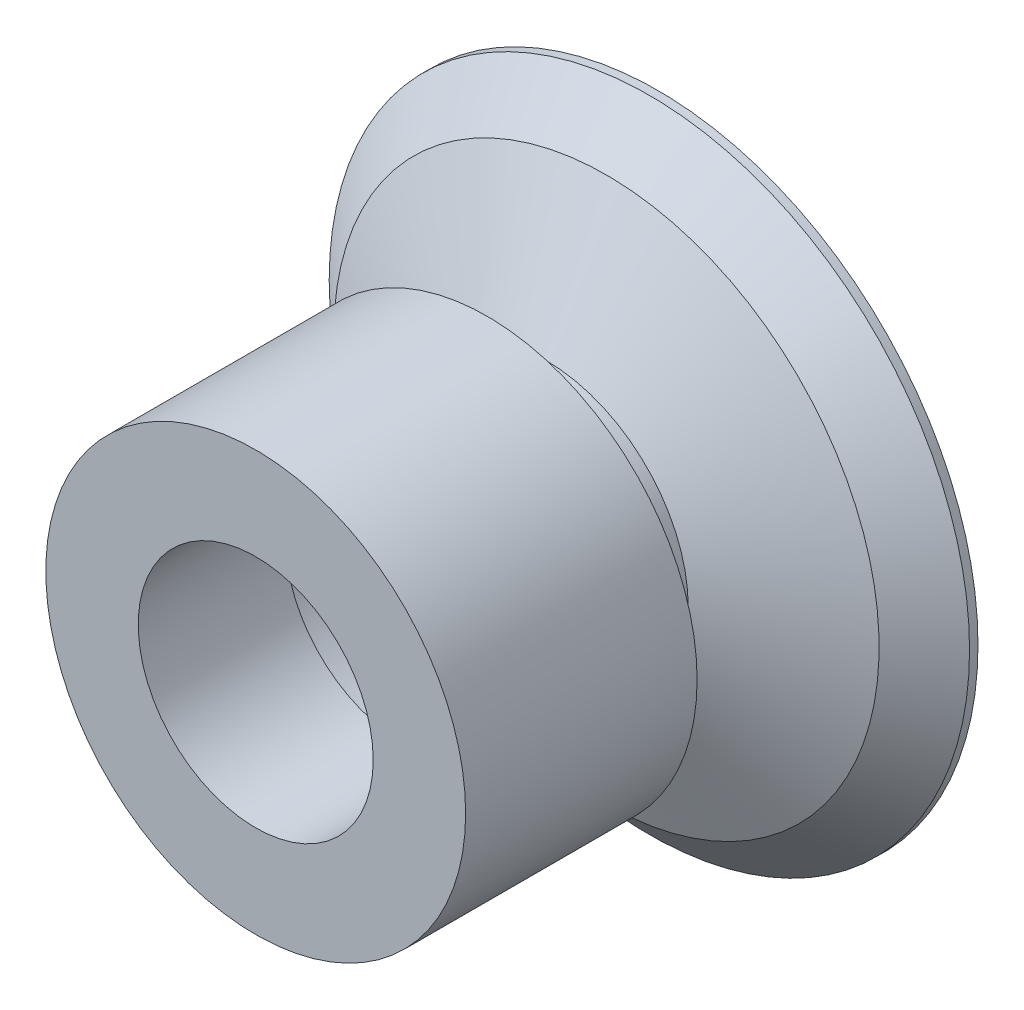
ISO-10303-21;
HEADER;
FILE_DESCRIPTION(('STEP AP214'),'2;1');
FILE_NAME('part.step','',(''),(''),'','','');
FILE_SCHEMA(('AUTOMOTIVE_DESIGN { 1 0 10303 214 1 1 1 1 }'));
ENDSEC;
DATA;
#1=APPLICATION_CONTEXT('core data for automotive mechanical design processes');
#2=APPLICATION_PROTOCOL_DEFINITION('international standard','automotive_design',2000,#1);
#3=PRODUCT_CONTEXT('',#1,'mechanical');
#4=PRODUCT('Part','Part','',(#3));
#5=PRODUCT_RELATED_PRODUCT_CATEGORY('part','',(#4));
#6=PRODUCT_DEFINITION_FORMATION('','',#4);
#7=PRODUCT_DEFINITION_CONTEXT('part definition',#1,'design');
#8=PRODUCT_DEFINITION('design','',#6,#7);
#9=PRODUCT_DEFINITION_SHAPE('','',#8);
#10=(LENGTH_UNIT() NAMED_UNIT(*) SI_UNIT(.MILLI.,.METRE.));
#11=(NAMED_UNIT(*) PLANE_ANGLE_UNIT() SI_UNIT($,.RADIAN.));
#12=(NAMED_UNIT(*) SI_UNIT($,.STERADIAN.) SOLID_ANGLE_UNIT());
#13=UNCERTAINTY_MEASURE_WITH_UNIT(LENGTH_MEASURE(1.E-05),#10,'distance_accuracy_value','');
#14=(GEOMETRIC_REPRESENTATION_CONTEXT(3) GLOBAL_UNCERTAINTY_ASSIGNED_CONTEXT((#13)) GLOBAL_UNIT_ASSIGNED_CONTEXT((#10,
#11,#12)) REPRESENTATION_CONTEXT('',''));
#15=CARTESIAN_POINT('',(0.,0.,0.));
#16=DIRECTION('',(0.,0.,1.));
#17=DIRECTION('',(1.,0.,0.));
#18=AXIS2_PLACEMENT_3D('',#15,#16,#17);
#19=CARTESIAN_POINT('',(2.,0.,-6.8));
#20=DIRECTION('',(0.,0.,1.));
#21=DIRECTION('',(1.,0.,0.));
#22=AXIS2_PLACEMENT_3D('',#19,#20,#21);
#23=PLANE('',#22);
#24=CARTESIAN_POINT('',(0.,0.,-6.8));
#25=DIRECTION('',(0.,0.,1.));
#26=DIRECTION('',(1.,0.,0.));
#27=AXIS2_PLACEMENT_3D('',#24,#25,#26);
#28=CIRCLE('',#27,2.);
#29=CARTESIAN_POINT('',(2.,0.,-6.8));
#30=VERTEX_POINT('',#29);
#31=EDGE_CURVE('E105',#30,#30,#28,.T.);
#32=ORIENTED_EDGE('',*,*,#31,.F.);
#33=EDGE_LOOP('',(#32));
#34=FACE_BOUND('',#33,.T.);
#35=CARTESIAN_POINT('',(0.,0.,-6.8));
#36=DIRECTION('',(0.,0.,1.));
#37=DIRECTION('',(1.,0.,0.));
#38=AXIS2_PLACEMENT_3D('',#35,#36,#37);
#39=CIRCLE('',#38,5.2);
#40=CARTESIAN_POINT('',(5.2,0.,-6.8));
#41=VERTEX_POINT('',#40);
#42=EDGE_CURVE('E113',#41,#41,#39,.T.);
#43=ORIENTED_EDGE('',*,*,#42,.T.);
#44=EDGE_LOOP('',(#43));
#45=FACE_BOUND('',#44,.T.);
#46=ADVANCED_FACE('F16',(#34,#45),#23,.T.);
#47=CARTESIAN_POINT('',(7.9404907888358,0.,-11.5));
#48=DIRECTION('',(0.,0.,-1.));
#49=DIRECTION('',(0.,-1.,0.));
#50=AXIS2_PLACEMENT_3D('',#47,#48,#49);
#51=PLANE('',#50);
#52=CARTESIAN_POINT('',(0.,0.,-11.5));
#53=DIRECTION('',(0.,0.,1.));
#54=DIRECTION('',(1.,0.,0.));
#55=AXIS2_PLACEMENT_3D('',#52,#53,#54);
#56=CIRCLE('',#55,2.);
#57=CARTESIAN_POINT('',(2.,0.,-11.5));
#58=VERTEX_POINT('',#57);
#59=EDGE_CURVE('E118',#58,#58,#56,.T.);
#60=ORIENTED_EDGE('',*,*,#59,.T.);
#61=EDGE_LOOP('',(#60));
#62=FACE_BOUND('',#61,.T.);
#63=CARTESIAN_POINT('',(0.,0.,-11.5));
#64=DIRECTION('',(0.,0.,1.));
#65=DIRECTION('',(1.,0.,0.));
#66=AXIS2_PLACEMENT_3D('',#63,#64,#65);
#67=CIRCLE('',#66,7.9404907888358);
#68=CARTESIAN_POINT('',(7.9404907888358,0.,-11.5));
#69=VERTEX_POINT('',#68);
#70=EDGE_CURVE('E97',#69,#69,#67,.T.);
#71=ORIENTED_EDGE('',*,*,#70,.F.);
#72=EDGE_LOOP('',(#71));
#73=FACE_BOUND('',#72,.T.);
#74=ADVANCED_FACE('F150',(#62,#73),#51,.T.);
#75=CARTESIAN_POINT('',(10.2192427366873,0.,-12.8333333333333));
#76=DIRECTION('',(0.,0.,-1.));
#77=DIRECTION('',(0.,-1.,0.));
#78=AXIS2_PLACEMENT_3D('',#75,#76,#77);
#79=PLANE('',#78);
#80=CARTESIAN_POINT('',(0.,0.,-12.8333333333333));
#81=DIRECTION('',(0.,0.,1.));
#82=DIRECTION('',(1.,0.,0.));
#83=AXIS2_PLACEMENT_3D('',#80,#81,#82);
#84=CIRCLE('',#83,10.);
#85=CARTESIAN_POINT('',(-10.,0.,-12.8333333333333));
#86=VERTEX_POINT('',#85);
#87=EDGE_CURVE('E92',#86,#86,#84,.T.);
#88=ORIENTED_EDGE('',*,*,#87,.T.);
#89=EDGE_LOOP('',(#88));
#90=FACE_BOUND('',#89,.T.);
#91=CARTESIAN_POINT('',(0.,0.,-12.8333333333333));
#92=DIRECTION('',(0.,0.,1.));
#93=DIRECTION('',(1.,0.,0.));
#94=AXIS2_PLACEMENT_3D('',#91,#92,#93);
#95=CIRCLE('',#94,10.2192427366873);
#96=CARTESIAN_POINT('',(-10.2192427366873,0.,-12.8333333333333));
#97=VERTEX_POINT('',#96);
#98=EDGE_CURVE('E96',#97,#97,#95,.T.);
#99=ORIENTED_EDGE('',*,*,#98,.F.);
#100=EDGE_LOOP('',(#99));
#101=FACE_BOUND('',#100,.T.);
#102=ADVANCED_FACE('F18',(#90,#101),#79,.T.);
#103=CARTESIAN_POINT('',(3.75,0.,0.));
#104=DIRECTION('',(0.,0.,1.));
#105=DIRECTION('',(1.,0.,0.));
#106=AXIS2_PLACEMENT_3D('',#103,#104,#105);
#107=PLANE('',#106);
#108=CARTESIAN_POINT('',(0.,0.,0.));
#109=DIRECTION('',(0.,0.,1.));
#110=DIRECTION('',(1.,0.,0.));
#111=AXIS2_PLACEMENT_3D('',#108,#109,#110);
#112=CIRCLE('',#111,3.75);
#113=CARTESIAN_POINT('',(3.75,0.,0.));
#114=VERTEX_POINT('',#113);
#115=EDGE_CURVE('E11',#114,#114,#112,.T.);
#116=ORIENTED_EDGE('',*,*,#115,.F.);
#117=EDGE_LOOP('',(#116));
#118=FACE_BOUND('',#117,.T.);
#119=CARTESIAN_POINT('',(0.,0.,0.));
#120=DIRECTION('',(0.,0.,1.));
#121=DIRECTION('',(1.,0.,0.));
#122=AXIS2_PLACEMENT_3D('',#119,#120,#121);
#123=CIRCLE('',#122,6.7);
#124=CARTESIAN_POINT('',(6.7,0.,0.));
#125=VERTEX_POINT('',#124);
#126=EDGE_CURVE('E175',#125,#125,#123,.T.);
#127=ORIENTED_EDGE('',*,*,#126,.T.);
#128=EDGE_LOOP('',(#127));
#129=FACE_BOUND('',#128,.T.);
#130=ADVANCED_FACE('F136',(#118,#129),#107,.T.);
#131=CARTESIAN_POINT('',(5.2,0.,-4.7));
#132=DIRECTION('',(0.,0.,-1.));
#133=DIRECTION('',(0.,-1.,0.));
#134=AXIS2_PLACEMENT_3D('',#131,#132,#133);
#135=PLANE('',#134);
#136=CARTESIAN_POINT('',(0.,0.,-4.7));
#137=DIRECTION('',(0.,0.,1.));
#138=DIRECTION('',(1.,0.,0.));
#139=AXIS2_PLACEMENT_3D('',#136,#137,#138);
#140=CIRCLE('',#139,3.75);
#141=CARTESIAN_POINT('',(3.75,0.,-4.7));
#142=VERTEX_POINT('',#141);
#143=EDGE_CURVE('E27',#142,#142,#140,.T.);
#144=ORIENTED_EDGE('',*,*,#143,.T.);
#145=EDGE_LOOP('',(#144));
#146=FACE_BOUND('',#145,.T.);
#147=CARTESIAN_POINT('',(0.,0.,-4.7));
#148=DIRECTION('',(0.,0.,1.));
#149=DIRECTION('',(1.,0.,0.));
#150=AXIS2_PLACEMENT_3D('',#147,#148,#149);
#151=CIRCLE('',#150,5.2);
#152=CARTESIAN_POINT('',(5.2,0.,-4.7));
#153=VERTEX_POINT('',#152);
#154=EDGE_CURVE('E20',#153,#153,#151,.T.);
#155=ORIENTED_EDGE('',*,*,#154,.F.);
#156=EDGE_LOOP('',(#155));
#157=FACE_BOUND('',#156,.T.);
#158=ADVANCED_FACE('F133',(#146,#157),#135,.T.);
#159=CARTESIAN_POINT('',(0.,0.,0.));
#160=DIRECTION('',(0.,0.,1.));
#161=DIRECTION('',(1.,0.,0.));
#162=AXIS2_PLACEMENT_3D('',#159,#160,#161);
#163=CYLINDRICAL_SURFACE('',#162,3.75);
#164=ORIENTED_EDGE('',*,*,#115,.T.);
#165=EDGE_LOOP('',(#164));
#166=FACE_BOUND('',#165,.T.);
#167=ORIENTED_EDGE('',*,*,#143,.F.);
#168=EDGE_LOOP('',(#167));
#169=FACE_BOUND('',#168,.T.);
#170=ADVANCED_FACE('F135',(#166,#169),#163,.F.);
#171=CARTESIAN_POINT('',(0.,0.,0.));
#172=DIRECTION('',(0.,0.,1.));
#173=DIRECTION('',(1.,0.,0.));
#174=AXIS2_PLACEMENT_3D('',#171,#172,#173);
#175=CYLINDRICAL_SURFACE('',#174,6.7);
#176=ORIENTED_EDGE('',*,*,#126,.F.);
#177=EDGE_LOOP('',(#176));
#178=FACE_BOUND('',#177,.T.);
#179=CARTESIAN_POINT('',(0.,0.,-7.38736139801687));
#180=DIRECTION('',(0.,0.,1.));
#181=DIRECTION('',(1.,0.,0.));
#182=AXIS2_PLACEMENT_3D('',#179,#180,#181);
#183=CIRCLE('',#182,6.7);
#184=CARTESIAN_POINT('',(6.7,0.,-7.38736139801687));
#185=VERTEX_POINT('',#184);
#186=EDGE_CURVE('E111',#185,#185,#183,.T.);
#187=ORIENTED_EDGE('',*,*,#186,.T.);
#188=EDGE_LOOP('',(#187));
#189=FACE_BOUND('',#188,.T.);
#190=ADVANCED_FACE('F144',(#178,#189),#175,.T.);
#191=CARTESIAN_POINT('',(0.,0.,-7.38736139801687));
#192=DIRECTION('',(0.,0.,1.));
#193=DIRECTION('',(1.,0.,0.));
#194=AXIS2_PLACEMENT_3D('',#191,#192,#193);
#195=CONICAL_SURFACE('',#194,6.7,0.994837673636784);
#196=ORIENTED_EDGE('',*,*,#186,.F.);
#197=EDGE_LOOP('',(#196));
#198=FACE_BOUND('',#197,.T.);
#199=CARTESIAN_POINT('',(0.,0.,-8.78653957608782));
#200=DIRECTION('',(0.,0.,1.));
#201=DIRECTION('',(1.,0.,0.));
#202=AXIS2_PLACEMENT_3D('',#199,#200,#201);
#203=CIRCLE('',#202,4.54545454545455);
#204=CARTESIAN_POINT('',(4.54545454545455,0.,-8.78653957608782));
#205=VERTEX_POINT('',#204);
#206=EDGE_CURVE('E109',#205,#205,#203,.T.);
#207=ORIENTED_EDGE('',*,*,#206,.T.);
#208=EDGE_LOOP('',(#207));
#209=FACE_BOUND('',#208,.T.);
#210=ADVANCED_FACE('F164',(#198,#209),#195,.T.);
#211=CARTESIAN_POINT('',(0.,0.,0.));
#212=DIRECTION('',(0.,0.,1.));
#213=DIRECTION('',(1.,0.,0.));
#214=AXIS2_PLACEMENT_3D('',#211,#212,#213);
#215=CYLINDRICAL_SURFACE('',#214,4.54545454545455);
#216=ORIENTED_EDGE('',*,*,#206,.F.);
#217=EDGE_LOOP('',(#216));
#218=FACE_BOUND('',#217,.T.);
#219=CARTESIAN_POINT('',(0.,0.,-9.25854996026619));
#220=DIRECTION('',(0.,0.,1.));
#221=DIRECTION('',(1.,0.,0.));
#222=AXIS2_PLACEMENT_3D('',#219,#220,#221);
#223=CIRCLE('',#222,4.54545454545455);
#224=CARTESIAN_POINT('',(-4.54545454545455,0.,-9.25854996026619));
#225=VERTEX_POINT('',#224);
#226=EDGE_CURVE('E112',#225,#225,#223,.T.);
#227=ORIENTED_EDGE('',*,*,#226,.T.);
#228=EDGE_LOOP('',(#227));
#229=FACE_BOUND('',#228,.T.);
#230=ADVANCED_FACE('F169',(#218,#229),#215,.T.);
#231=CARTESIAN_POINT('',(0.,0.,-9.25854996026619));
#232=DIRECTION('',(0.,0.,-1.));
#233=DIRECTION('',(-1.,0.,0.));
#234=AXIS2_PLACEMENT_3D('',#231,#232,#233);
#235=CONICAL_SURFACE('',#234,4.54545454545455,1.13446401379632);
#236=CARTESIAN_POINT('',(0.,0.,-11.1959273395966));
#237=DIRECTION('',(0.,0.,1.));
#238=DIRECTION('',(1.,0.,0.));
#239=AXIS2_PLACEMENT_3D('',#236,#237,#238);
#240=CIRCLE('',#239,8.70017374306742);
#241=CARTESIAN_POINT('',(-8.70017374306742,0.,-11.1959273395966));
#242=VERTEX_POINT('',#241);
#243=EDGE_CURVE('E184',#242,#242,#240,.T.);
#244=ORIENTED_EDGE('',*,*,#243,.T.);
#245=EDGE_LOOP('',(#244));
#246=FACE_BOUND('',#245,.T.);
#247=ORIENTED_EDGE('',*,*,#226,.F.);
#248=EDGE_LOOP('',(#247));
#249=FACE_BOUND('',#248,.T.);
#250=ADVANCED_FACE('F273',(#246,#249),#235,.T.);
#251=CARTESIAN_POINT('',(0.,0.,-11.1959273395966));
#252=DIRECTION('',(0.,0.,-1.));
#253=DIRECTION('',(-1.,0.,0.));
#254=AXIS2_PLACEMENT_3D('',#251,#252,#253);
#255=CONICAL_SURFACE('',#254,8.70017374306742,0.83775804095727);
#256=CARTESIAN_POINT('',(0.,0.,-12.5637032050195));
#257=DIRECTION('',(0.,0.,1.));
#258=DIRECTION('',(1.,0.,0.));
#259=AXIS2_PLACEMENT_3D('',#256,#257,#258);
#260=CIRCLE('',#259,10.2192427366873);
#261=CARTESIAN_POINT('',(10.2192427366873,0.,-12.5637032050195));
#262=VERTEX_POINT('',#261);
#263=EDGE_CURVE('E104',#262,#262,#260,.T.);
#264=ORIENTED_EDGE('',*,*,#263,.T.);
#265=EDGE_LOOP('',(#264));
#266=FACE_BOUND('',#265,.T.);
#267=ORIENTED_EDGE('',*,*,#243,.F.);
#268=EDGE_LOOP('',(#267));
#269=FACE_BOUND('',#268,.T.);
#270=ADVANCED_FACE('F277',(#266,#269),#255,.T.);
#271=CARTESIAN_POINT('',(0.,0.,0.));
#272=DIRECTION('',(0.,0.,1.));
#273=DIRECTION('',(1.,0.,0.));
#274=AXIS2_PLACEMENT_3D('',#271,#272,#273);
#275=CYLINDRICAL_SURFACE('',#274,10.2192427366873);
#276=ORIENTED_EDGE('',*,*,#263,.F.);
#277=EDGE_LOOP('',(#276));
#278=FACE_BOUND('',#277,.T.);
#279=ORIENTED_EDGE('',*,*,#98,.T.);
#280=EDGE_LOOP('',(#279));
#281=FACE_BOUND('',#280,.T.);
#282=ADVANCED_FACE('F161',(#278,#281),#275,.T.);
#283=CARTESIAN_POINT('',(0.,0.,-12.8333333333333));
#284=DIRECTION('',(0.,0.,-1.));
#285=DIRECTION('',(-1.,0.,0.));
#286=AXIS2_PLACEMENT_3D('',#283,#284,#285);
#287=CONICAL_SURFACE('',#286,10.,0.996248627239103);
#288=ORIENTED_EDGE('',*,*,#87,.F.);
#289=EDGE_LOOP('',(#288));
#290=FACE_BOUND('',#289,.T.);
#291=ORIENTED_EDGE('',*,*,#70,.T.);
#292=EDGE_LOOP('',(#291));
#293=FACE_BOUND('',#292,.T.);
#294=ADVANCED_FACE('F241',(#290,#293),#287,.F.);
#295=CARTESIAN_POINT('',(0.,0.,0.));
#296=DIRECTION('',(0.,0.,1.));
#297=DIRECTION('',(1.,0.,0.));
#298=AXIS2_PLACEMENT_3D('',#295,#296,#297);
#299=CYLINDRICAL_SURFACE('',#298,2.);
#300=ORIENTED_EDGE('',*,*,#31,.T.);
#301=EDGE_LOOP('',(#300));
#302=FACE_BOUND('',#301,.T.);
#303=ORIENTED_EDGE('',*,*,#59,.F.);
#304=EDGE_LOOP('',(#303));
#305=FACE_BOUND('',#304,.T.);
#306=ADVANCED_FACE('F245',(#302,#305),#299,.F.);
#307=CARTESIAN_POINT('',(0.,0.,0.));
#308=DIRECTION('',(0.,0.,1.));
#309=DIRECTION('',(1.,0.,0.));
#310=AXIS2_PLACEMENT_3D('',#307,#308,#309);
#311=CYLINDRICAL_SURFACE('',#310,5.2);
#312=ORIENTED_EDGE('',*,*,#154,.T.);
#313=EDGE_LOOP('',(#312));
#314=FACE_BOUND('',#313,.T.);
#315=ORIENTED_EDGE('',*,*,#42,.F.);
#316=EDGE_LOOP('',(#315));
#317=FACE_BOUND('',#316,.T.);
#318=ADVANCED_FACE('F130',(#314,#317),#311,.F.);
#319=CLOSED_SHELL('',(#46,#74,#102,#130,#158,#170,#190,#210,#230,#250,#270,#282,#294,#306,#318));
#320=MANIFOLD_SOLID_BREP('B1',#319);
#321=ADVANCED_BREP_SHAPE_REPRESENTATION('',(#18,#320),#14);
#322=SHAPE_DEFINITION_REPRESENTATION(#9,#321);
ENDSEC;
END-ISO-10303-21;
